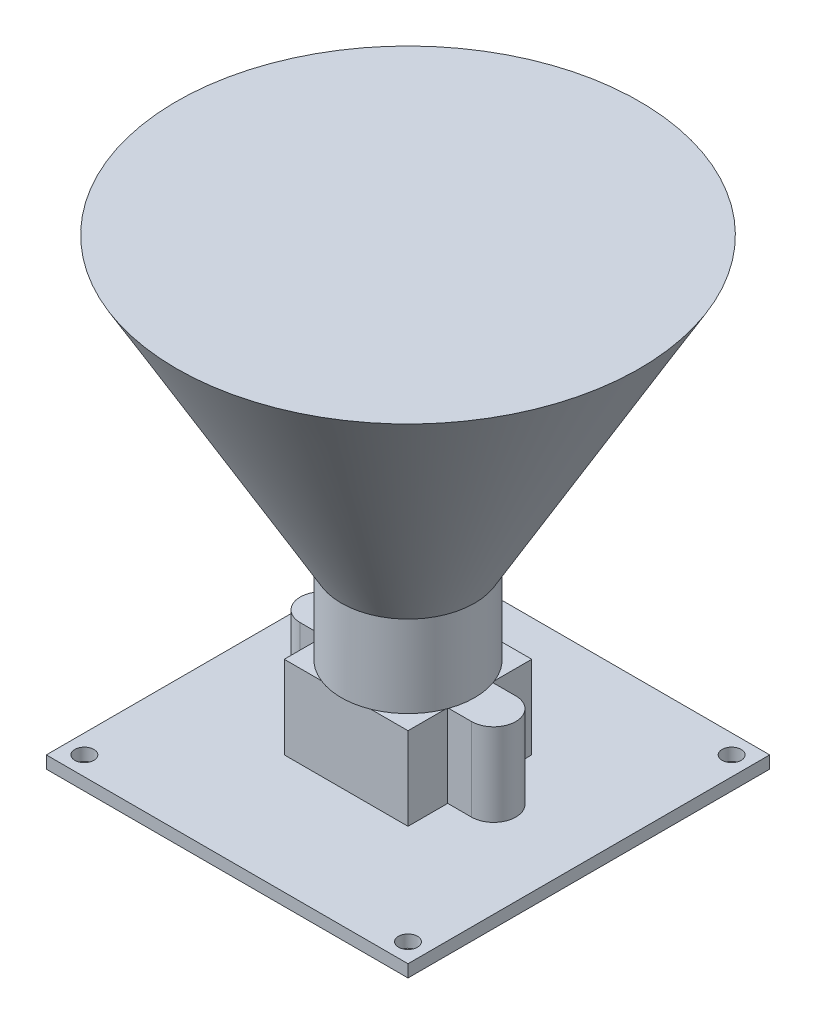
ISO-10303-21;
HEADER;
FILE_DESCRIPTION(('STEP AP214'),'2;1');
FILE_NAME('part.step','',(''),(''),'','','');
FILE_SCHEMA(('AUTOMOTIVE_DESIGN { 1 0 10303 214 1 1 1 1 }'));
ENDSEC;
DATA;
#1=APPLICATION_CONTEXT('core data for automotive mechanical design processes');
#2=APPLICATION_PROTOCOL_DEFINITION('international standard','automotive_design',2000,#1);
#3=PRODUCT_CONTEXT('',#1,'mechanical');
#4=PRODUCT('Part','Part','',(#3));
#5=PRODUCT_RELATED_PRODUCT_CATEGORY('part','',(#4));
#6=PRODUCT_DEFINITION_FORMATION('','',#4);
#7=PRODUCT_DEFINITION_CONTEXT('part definition',#1,'design');
#8=PRODUCT_DEFINITION('design','',#6,#7);
#9=PRODUCT_DEFINITION_SHAPE('','',#8);
#10=(LENGTH_UNIT() NAMED_UNIT(*) SI_UNIT(.MILLI.,.METRE.));
#11=(NAMED_UNIT(*) PLANE_ANGLE_UNIT() SI_UNIT($,.RADIAN.));
#12=(NAMED_UNIT(*) SI_UNIT($,.STERADIAN.) SOLID_ANGLE_UNIT());
#13=UNCERTAINTY_MEASURE_WITH_UNIT(LENGTH_MEASURE(1.E-05),#10,'distance_accuracy_value','');
#14=(GEOMETRIC_REPRESENTATION_CONTEXT(3) GLOBAL_UNCERTAINTY_ASSIGNED_CONTEXT((#13)) GLOBAL_UNIT_ASSIGNED_CONTEXT((#10,
#11,#12)) REPRESENTATION_CONTEXT('',''));
#15=CARTESIAN_POINT('',(0.,0.,0.));
#16=DIRECTION('',(0.,0.,1.));
#17=DIRECTION('',(1.,0.,0.));
#18=AXIS2_PLACEMENT_3D('',#15,#16,#17);
#19=CARTESIAN_POINT('',(-4.38653846154582,10.,5.00576923076922));
#20=DIRECTION('',(0.,1.,0.));
#21=DIRECTION('',(0.,0.,1.));
#22=AXIS2_PLACEMENT_3D('',#19,#20,#21);
#23=PLANE('',#22);
#24=CARTESIAN_POINT('',(4.61346153845418,10.,5.00576923076922));
#25=DIRECTION('',(0.,1.,0.));
#26=DIRECTION('',(0.,0.,1.));
#27=AXIS2_PLACEMENT_3D('',#24,#25,#26);
#28=CIRCLE('',#27,7.);
#29=CARTESIAN_POINT('',(7.2115377498075,10.,11.5057692307692));
#30=VERTEX_POINT('',#29);
#31=CARTESIAN_POINT('',(11.1134615384542,10.,7.60384544212254));
#32=VERTEX_POINT('',#31);
#33=EDGE_CURVE('E215',#30,#32,#28,.T.);
#34=ORIENTED_EDGE('',*,*,#33,.F.);
#35=DIRECTION('',(1.,0.,0.));
#36=VECTOR('',#35,1.);
#37=CARTESIAN_POINT('',(-1.88653846154582,10.,11.5057692307692));
#38=LINE('',#37,#36);
#39=CARTESIAN_POINT('',(11.1134615384542,10.,11.5057692307692));
#40=VERTEX_POINT('',#39);
#41=EDGE_CURVE('E201',#30,#40,#38,.T.);
#42=ORIENTED_EDGE('',*,*,#41,.T.);
#43=DIRECTION('',(0.,0.,-1.));
#44=VECTOR('',#43,1.);
#45=CARTESIAN_POINT('',(11.1134615384542,10.,11.5057692307692));
#46=LINE('',#45,#44);
#47=EDGE_CURVE('E267',#40,#32,#46,.T.);
#48=ORIENTED_EDGE('',*,*,#47,.T.);
#49=EDGE_LOOP('',(#34,#42,#48));
#50=FACE_BOUND('',#49,.T.);
#51=ADVANCED_FACE('F38',(#50),#23,.T.);
#52=CARTESIAN_POINT('',(11.2150175404706,10.,7.3337422444104));
#53=VERTEX_POINT('',#52);
#54=CARTESIAN_POINT('',(11.2150175404706,10.,2.67779621712804));
#55=VERTEX_POINT('',#54);
#56=EDGE_CURVE('E11',#53,#55,#28,.T.);
#57=ORIENTED_EDGE('',*,*,#56,.F.);
#58=DIRECTION('',(1.,0.,0.));
#59=VECTOR('',#58,1.);
#60=CARTESIAN_POINT('',(11.1134615384542,10.,7.3337422444104));
#61=LINE('',#60,#59);
#62=CARTESIAN_POINT('',(13.6134615384542,10.,7.33374224441039));
#63=VERTEX_POINT('',#62);
#64=EDGE_CURVE('E270',#53,#63,#61,.T.);
#65=ORIENTED_EDGE('',*,*,#64,.T.);
#66=CARTESIAN_POINT('',(13.6134615384542,10.,5.00576923076922));
#67=DIRECTION('',(0.,1.,0.));
#68=DIRECTION('',(0.,0.,1.));
#69=AXIS2_PLACEMENT_3D('',#66,#67,#68);
#70=CIRCLE('',#69,2.32797301364118);
#71=CARTESIAN_POINT('',(13.6134615384542,10.,2.67779621712805));
#72=VERTEX_POINT('',#71);
#73=EDGE_CURVE('E274',#63,#72,#70,.T.);
#74=ORIENTED_EDGE('',*,*,#73,.T.);
#75=DIRECTION('',(-1.,0.,0.));
#76=VECTOR('',#75,1.);
#77=CARTESIAN_POINT('',(11.1134615384542,10.,2.67779621712804));
#78=LINE('',#77,#76);
#79=EDGE_CURVE('E276',#72,#55,#78,.T.);
#80=ORIENTED_EDGE('',*,*,#79,.T.);
#81=EDGE_LOOP('',(#57,#65,#74,#80));
#82=FACE_BOUND('',#81,.T.);
#83=ADVANCED_FACE('F414',(#82),#23,.T.);
#84=CARTESIAN_POINT('',(11.1134615384542,10.,2.4076930194159));
#85=VERTEX_POINT('',#84);
#86=CARTESIAN_POINT('',(7.21153774980749,10.,-1.49423076923078));
#87=VERTEX_POINT('',#86);
#88=EDGE_CURVE('E47',#85,#87,#28,.T.);
#89=ORIENTED_EDGE('',*,*,#88,.F.);
#90=DIRECTION('',(0.,0.,-1.));
#91=VECTOR('',#90,1.);
#92=CARTESIAN_POINT('',(11.1134615384542,10.,2.67779621712804));
#93=LINE('',#92,#91);
#94=CARTESIAN_POINT('',(11.1134615384542,10.,-1.49423076923078));
#95=VERTEX_POINT('',#94);
#96=EDGE_CURVE('E304',#85,#95,#93,.T.);
#97=ORIENTED_EDGE('',*,*,#96,.T.);
#98=DIRECTION('',(-1.,0.,0.));
#99=VECTOR('',#98,1.);
#100=CARTESIAN_POINT('',(-1.88653846154582,10.,-1.49423076923078));
#101=LINE('',#100,#99);
#102=EDGE_CURVE('E794',#95,#87,#101,.T.);
#103=ORIENTED_EDGE('',*,*,#102,.T.);
#104=EDGE_LOOP('',(#89,#97,#103));
#105=FACE_BOUND('',#104,.T.);
#106=ADVANCED_FACE('F420',(#105),#23,.T.);
#107=CARTESIAN_POINT('',(2.01538532710086,10.,-1.49423076923078));
#108=VERTEX_POINT('',#107);
#109=CARTESIAN_POINT('',(-1.88653846154582,10.,2.40769301941591));
#110=VERTEX_POINT('',#109);
#111=EDGE_CURVE('E221',#108,#110,#28,.T.);
#112=ORIENTED_EDGE('',*,*,#111,.F.);
#113=CARTESIAN_POINT('',(-1.88653846154582,10.,-1.49423076923078));
#114=VERTEX_POINT('',#113);
#115=EDGE_CURVE('E792',#108,#114,#101,.T.);
#116=ORIENTED_EDGE('',*,*,#115,.T.);
#117=DIRECTION('',(0.,0.,1.));
#118=VECTOR('',#117,1.);
#119=CARTESIAN_POINT('',(-1.88653846154582,10.,2.67779621712805));
#120=LINE('',#119,#118);
#121=EDGE_CURVE('E257',#114,#110,#120,.T.);
#122=ORIENTED_EDGE('',*,*,#121,.T.);
#123=EDGE_LOOP('',(#112,#116,#122));
#124=FACE_BOUND('',#123,.T.);
#125=ADVANCED_FACE('F436',(#124),#23,.T.);
#126=CARTESIAN_POINT('',(-1.9880944635622,10.,2.67779621712805));
#127=VERTEX_POINT('',#126);
#128=CARTESIAN_POINT('',(-1.9880944635622,10.,7.3337422444104));
#129=VERTEX_POINT('',#128);
#130=EDGE_CURVE('E220',#127,#129,#28,.T.);
#131=ORIENTED_EDGE('',*,*,#130,.F.);
#132=DIRECTION('',(-1.,0.,0.));
#133=VECTOR('',#132,1.);
#134=CARTESIAN_POINT('',(-4.38653846154582,10.,2.67779621712805));
#135=LINE('',#134,#133);
#136=CARTESIAN_POINT('',(-4.38653846154582,10.,2.67779621712805));
#137=VERTEX_POINT('',#136);
#138=EDGE_CURVE('E253',#127,#137,#135,.T.);
#139=ORIENTED_EDGE('',*,*,#138,.T.);
#140=CARTESIAN_POINT('',(-4.38653846154582,10.,5.00576923076922));
#141=DIRECTION('',(0.,1.,0.));
#142=DIRECTION('',(0.,0.,1.));
#143=AXIS2_PLACEMENT_3D('',#140,#141,#142);
#144=CIRCLE('',#143,2.32797301364118);
#145=CARTESIAN_POINT('',(-4.38653846154582,10.,7.3337422444104));
#146=VERTEX_POINT('',#145);
#147=EDGE_CURVE('E252',#137,#146,#144,.T.);
#148=ORIENTED_EDGE('',*,*,#147,.T.);
#149=DIRECTION('',(1.,0.,0.));
#150=VECTOR('',#149,1.);
#151=CARTESIAN_POINT('',(-4.38653846154582,10.,7.3337422444104));
#152=LINE('',#151,#150);
#153=EDGE_CURVE('E261',#146,#129,#152,.T.);
#154=ORIENTED_EDGE('',*,*,#153,.T.);
#155=EDGE_LOOP('',(#131,#139,#148,#154));
#156=FACE_BOUND('',#155,.T.);
#157=ADVANCED_FACE('F426',(#156),#23,.T.);
#158=CARTESIAN_POINT('',(0.,1.3,0.));
#159=DIRECTION('',(0.,1.,0.));
#160=DIRECTION('',(0.,0.,1.));
#161=AXIS2_PLACEMENT_3D('',#158,#159,#160);
#162=PLANE('',#161);
#163=CARTESIAN_POINT('',(21.6134615384542,1.3,22.0057692307662));
#164=DIRECTION('',(0.,1.,0.));
#165=DIRECTION('',(0.,0.,1.));
#166=AXIS2_PLACEMENT_3D('',#163,#164,#165);
#167=CIRCLE('',#166,1.);
#168=CARTESIAN_POINT('',(21.6134615384542,1.3,23.0057692307662));
#169=VERTEX_POINT('',#168);
#170=EDGE_CURVE('E343',#169,#169,#167,.T.);
#171=ORIENTED_EDGE('',*,*,#170,.F.);
#172=EDGE_LOOP('',(#171));
#173=FACE_BOUND('',#172,.T.);
#174=CARTESIAN_POINT('',(-12.3865384615458,1.3,-11.9942307692338));
#175=DIRECTION('',(0.,1.,0.));
#176=DIRECTION('',(0.,0.,1.));
#177=AXIS2_PLACEMENT_3D('',#174,#175,#176);
#178=CIRCLE('',#177,1.);
#179=CARTESIAN_POINT('',(-12.3865384615458,1.3,-10.9942307692338));
#180=VERTEX_POINT('',#179);
#181=EDGE_CURVE('E355',#180,#180,#178,.T.);
#182=ORIENTED_EDGE('',*,*,#181,.F.);
#183=EDGE_LOOP('',(#182));
#184=FACE_BOUND('',#183,.T.);
#185=DIRECTION('',(0.,0.,1.));
#186=VECTOR('',#185,1.);
#187=CARTESIAN_POINT('',(-14.3865384615458,1.3,-13.9942307692308));
#188=LINE('',#187,#186);
#189=CARTESIAN_POINT('',(-14.3865384615458,1.3,-13.9942307692308));
#190=VERTEX_POINT('',#189);
#191=CARTESIAN_POINT('',(-14.3865384615458,1.3,24.0057692307692));
#192=VERTEX_POINT('',#191);
#193=EDGE_CURVE('E361',#190,#192,#188,.T.);
#194=ORIENTED_EDGE('',*,*,#193,.T.);
#195=DIRECTION('',(1.,0.,0.));
#196=VECTOR('',#195,1.);
#197=CARTESIAN_POINT('',(-14.3865384615458,1.3,24.0057692307692));
#198=LINE('',#197,#196);
#199=CARTESIAN_POINT('',(23.6134615384542,1.3,24.0057692307692));
#200=VERTEX_POINT('',#199);
#201=EDGE_CURVE('E364',#192,#200,#198,.T.);
#202=ORIENTED_EDGE('',*,*,#201,.T.);
#203=DIRECTION('',(0.,0.,-1.));
#204=VECTOR('',#203,1.);
#205=CARTESIAN_POINT('',(23.6134615384542,1.3,-13.9942307692308));
#206=LINE('',#205,#204);
#207=CARTESIAN_POINT('',(23.6134615384542,1.3,-13.9942307692308));
#208=VERTEX_POINT('',#207);
#209=EDGE_CURVE('E367',#200,#208,#206,.T.);
#210=ORIENTED_EDGE('',*,*,#209,.T.);
#211=DIRECTION('',(-1.,0.,0.));
#212=VECTOR('',#211,1.);
#213=CARTESIAN_POINT('',(-14.3865384615458,1.3,-13.9942307692308));
#214=LINE('',#213,#212);
#215=EDGE_CURVE('E369',#208,#190,#214,.T.);
#216=ORIENTED_EDGE('',*,*,#215,.T.);
#217=EDGE_LOOP('',(#194,#202,#210,#216));
#218=FACE_BOUND('',#217,.T.);
#219=CARTESIAN_POINT('',(21.6134615384542,1.3,-11.9942307692338));
#220=DIRECTION('',(0.,1.,0.));
#221=DIRECTION('',(0.,0.,1.));
#222=AXIS2_PLACEMENT_3D('',#219,#220,#221);
#223=CIRCLE('',#222,1.);
#224=CARTESIAN_POINT('',(21.6134615384542,1.3,-10.9942307692338));
#225=VERTEX_POINT('',#224);
#226=EDGE_CURVE('E349',#225,#225,#223,.T.);
#227=ORIENTED_EDGE('',*,*,#226,.F.);
#228=EDGE_LOOP('',(#227));
#229=FACE_BOUND('',#228,.T.);
#230=CARTESIAN_POINT('',(-12.3865384615458,1.3,22.0057692307662));
#231=DIRECTION('',(0.,1.,0.));
#232=DIRECTION('',(0.,0.,1.));
#233=AXIS2_PLACEMENT_3D('',#230,#231,#232);
#234=CIRCLE('',#233,1.);
#235=CARTESIAN_POINT('',(-12.3865384615458,1.3,23.0057692307662));
#236=VERTEX_POINT('',#235);
#237=EDGE_CURVE('E337',#236,#236,#234,.T.);
#238=ORIENTED_EDGE('',*,*,#237,.F.);
#239=EDGE_LOOP('',(#238));
#240=FACE_BOUND('',#239,.T.);
#241=DIRECTION('',(-1.,0.,0.));
#242=VECTOR('',#241,1.);
#243=CARTESIAN_POINT('',(-1.88653846154582,1.3,-1.49423076923078));
#244=LINE('',#243,#242);
#245=CARTESIAN_POINT('',(11.1134615384542,1.3,-1.49423076923078));
#246=VERTEX_POINT('',#245);
#247=CARTESIAN_POINT('',(-1.88653846154582,1.3,-1.49423076923078));
#248=VERTEX_POINT('',#247);
#249=EDGE_CURVE('E281',#246,#248,#244,.T.);
#250=ORIENTED_EDGE('',*,*,#249,.F.);
#251=DIRECTION('',(0.,0.,-1.));
#252=VECTOR('',#251,1.);
#253=CARTESIAN_POINT('',(11.1134615384542,1.3,2.67779621712804));
#254=LINE('',#253,#252);
#255=CARTESIAN_POINT('',(11.1134615384542,1.3,2.67779621712804));
#256=VERTEX_POINT('',#255);
#257=EDGE_CURVE('E229',#256,#246,#254,.T.);
#258=ORIENTED_EDGE('',*,*,#257,.F.);
#259=DIRECTION('',(-1.,0.,0.));
#260=VECTOR('',#259,1.);
#261=CARTESIAN_POINT('',(11.1134615384542,1.3,2.67779621712804));
#262=LINE('',#261,#260);
#263=CARTESIAN_POINT('',(13.6134615384542,1.3,2.67779621712804));
#264=VERTEX_POINT('',#263);
#265=EDGE_CURVE('E302',#264,#256,#262,.T.);
#266=ORIENTED_EDGE('',*,*,#265,.F.);
#267=CARTESIAN_POINT('',(13.6134615384542,1.3,5.00576923076922));
#268=DIRECTION('',(0.,1.,0.));
#269=DIRECTION('',(0.,0.,1.));
#270=AXIS2_PLACEMENT_3D('',#267,#268,#269);
#271=CIRCLE('',#270,2.32797301364118);
#272=CARTESIAN_POINT('',(13.6134615384542,1.3,7.33374224441039));
#273=VERTEX_POINT('',#272);
#274=EDGE_CURVE('E299',#273,#264,#271,.T.);
#275=ORIENTED_EDGE('',*,*,#274,.F.);
#276=DIRECTION('',(1.,0.,0.));
#277=VECTOR('',#276,1.);
#278=CARTESIAN_POINT('',(11.1134615384542,1.3,7.3337422444104));
#279=LINE('',#278,#277);
#280=CARTESIAN_POINT('',(11.1134615384542,1.3,7.3337422444104));
#281=VERTEX_POINT('',#280);
#282=EDGE_CURVE('E297',#281,#273,#279,.T.);
#283=ORIENTED_EDGE('',*,*,#282,.F.);
#284=DIRECTION('',(0.,0.,-1.));
#285=VECTOR('',#284,1.);
#286=CARTESIAN_POINT('',(11.1134615384542,1.3,11.5057692307692));
#287=LINE('',#286,#285);
#288=CARTESIAN_POINT('',(11.1134615384542,1.3,11.5057692307692));
#289=VERTEX_POINT('',#288);
#290=EDGE_CURVE('E295',#289,#281,#287,.T.);
#291=ORIENTED_EDGE('',*,*,#290,.F.);
#292=DIRECTION('',(1.,0.,0.));
#293=VECTOR('',#292,1.);
#294=CARTESIAN_POINT('',(-1.88653846154582,1.3,11.5057692307692));
#295=LINE('',#294,#293);
#296=CARTESIAN_POINT('',(-1.88653846154582,1.3,11.5057692307692));
#297=VERTEX_POINT('',#296);
#298=EDGE_CURVE('E293',#297,#289,#295,.T.);
#299=ORIENTED_EDGE('',*,*,#298,.F.);
#300=DIRECTION('',(0.,0.,1.));
#301=VECTOR('',#300,1.);
#302=CARTESIAN_POINT('',(-1.88653846154582,1.3,11.5057692307692));
#303=LINE('',#302,#301);
#304=CARTESIAN_POINT('',(-1.88653846154582,1.3,7.3337422444104));
#305=VERTEX_POINT('',#304);
#306=EDGE_CURVE('E291',#305,#297,#303,.T.);
#307=ORIENTED_EDGE('',*,*,#306,.F.);
#308=DIRECTION('',(1.,0.,0.));
#309=VECTOR('',#308,1.);
#310=CARTESIAN_POINT('',(-4.38653846154582,1.3,7.3337422444104));
#311=LINE('',#310,#309);
#312=CARTESIAN_POINT('',(-4.38653846154582,1.3,7.3337422444104));
#313=VERTEX_POINT('',#312);
#314=EDGE_CURVE('E289',#313,#305,#311,.T.);
#315=ORIENTED_EDGE('',*,*,#314,.F.);
#316=CARTESIAN_POINT('',(-4.38653846154582,1.3,5.00576923076922));
#317=DIRECTION('',(0.,1.,0.));
#318=DIRECTION('',(0.,0.,1.));
#319=AXIS2_PLACEMENT_3D('',#316,#317,#318);
#320=CIRCLE('',#319,2.32797301364118);
#321=CARTESIAN_POINT('',(-4.38653846154582,1.3,2.67779621712805));
#322=VERTEX_POINT('',#321);
#323=EDGE_CURVE('E287',#322,#313,#320,.T.);
#324=ORIENTED_EDGE('',*,*,#323,.F.);
#325=DIRECTION('',(-1.,0.,0.));
#326=VECTOR('',#325,1.);
#327=CARTESIAN_POINT('',(-4.38653846154582,1.3,2.67779621712805));
#328=LINE('',#327,#326);
#329=CARTESIAN_POINT('',(-1.88653846154582,1.3,2.67779621712805));
#330=VERTEX_POINT('',#329);
#331=EDGE_CURVE('E285',#330,#322,#328,.T.);
#332=ORIENTED_EDGE('',*,*,#331,.F.);
#333=DIRECTION('',(0.,0.,1.));
#334=VECTOR('',#333,1.);
#335=CARTESIAN_POINT('',(-1.88653846154582,1.3,2.67779621712805));
#336=LINE('',#335,#334);
#337=EDGE_CURVE('E283',#248,#330,#336,.T.);
#338=ORIENTED_EDGE('',*,*,#337,.F.);
#339=EDGE_LOOP('',(#250,#258,#266,#275,#283,#291,#299,#307,#315,#324,#332,#338));
#340=FACE_BOUND('',#339,.T.);
#341=ADVANCED_FACE('F404',(#173,#184,#218,#229,#240,#340),#162,.T.);
#342=CARTESIAN_POINT('',(0.,0.,0.));
#343=DIRECTION('',(0.,1.,0.));
#344=DIRECTION('',(0.,0.,1.));
#345=AXIS2_PLACEMENT_3D('',#342,#343,#344);
#346=PLANE('',#345);
#347=DIRECTION('',(0.,0.,1.));
#348=VECTOR('',#347,1.);
#349=CARTESIAN_POINT('',(-14.3865384615458,0.,-13.9942307692308));
#350=LINE('',#349,#348);
#351=CARTESIAN_POINT('',(-14.3865384615458,0.,-13.9942307692308));
#352=VERTEX_POINT('',#351);
#353=CARTESIAN_POINT('',(-14.3865384615458,0.,24.0057692307692));
#354=VERTEX_POINT('',#353);
#355=EDGE_CURVE('E358',#352,#354,#350,.T.);
#356=ORIENTED_EDGE('',*,*,#355,.F.);
#357=DIRECTION('',(-1.,0.,0.));
#358=VECTOR('',#357,1.);
#359=CARTESIAN_POINT('',(-14.3865384615458,0.,-13.9942307692308));
#360=LINE('',#359,#358);
#361=CARTESIAN_POINT('',(23.6134615384542,0.,-13.9942307692308));
#362=VERTEX_POINT('',#361);
#363=EDGE_CURVE('E365',#362,#352,#360,.T.);
#364=ORIENTED_EDGE('',*,*,#363,.F.);
#365=DIRECTION('',(0.,0.,-1.));
#366=VECTOR('',#365,1.);
#367=CARTESIAN_POINT('',(23.6134615384542,0.,-13.9942307692308));
#368=LINE('',#367,#366);
#369=CARTESIAN_POINT('',(23.6134615384542,0.,24.0057692307692));
#370=VERTEX_POINT('',#369);
#371=EDGE_CURVE('E376',#370,#362,#368,.T.);
#372=ORIENTED_EDGE('',*,*,#371,.F.);
#373=DIRECTION('',(1.,0.,0.));
#374=VECTOR('',#373,1.);
#375=CARTESIAN_POINT('',(-14.3865384615458,0.,24.0057692307692));
#376=LINE('',#375,#374);
#377=EDGE_CURVE('E374',#354,#370,#376,.T.);
#378=ORIENTED_EDGE('',*,*,#377,.F.);
#379=EDGE_LOOP('',(#356,#364,#372,#378));
#380=FACE_BOUND('',#379,.T.);
#381=CARTESIAN_POINT('',(-12.3865384615458,0.,-11.9942307692338));
#382=DIRECTION('',(0.,1.,0.));
#383=DIRECTION('',(0.,0.,1.));
#384=AXIS2_PLACEMENT_3D('',#381,#382,#383);
#385=CIRCLE('',#384,1.);
#386=CARTESIAN_POINT('',(-12.3865384615458,0.,-10.9942307692338));
#387=VERTEX_POINT('',#386);
#388=EDGE_CURVE('E352',#387,#387,#385,.T.);
#389=ORIENTED_EDGE('',*,*,#388,.T.);
#390=EDGE_LOOP('',(#389));
#391=FACE_BOUND('',#390,.T.);
#392=CARTESIAN_POINT('',(21.6134615384542,0.,-11.9942307692338));
#393=DIRECTION('',(0.,1.,0.));
#394=DIRECTION('',(0.,0.,1.));
#395=AXIS2_PLACEMENT_3D('',#392,#393,#394);
#396=CIRCLE('',#395,1.);
#397=CARTESIAN_POINT('',(21.6134615384542,0.,-10.9942307692338));
#398=VERTEX_POINT('',#397);
#399=EDGE_CURVE('E346',#398,#398,#396,.T.);
#400=ORIENTED_EDGE('',*,*,#399,.T.);
#401=EDGE_LOOP('',(#400));
#402=FACE_BOUND('',#401,.T.);
#403=CARTESIAN_POINT('',(21.6134615384542,0.,22.0057692307662));
#404=DIRECTION('',(0.,1.,0.));
#405=DIRECTION('',(0.,0.,1.));
#406=AXIS2_PLACEMENT_3D('',#403,#404,#405);
#407=CIRCLE('',#406,1.);
#408=CARTESIAN_POINT('',(21.6134615384542,0.,23.0057692307662));
#409=VERTEX_POINT('',#408);
#410=EDGE_CURVE('E340',#409,#409,#407,.T.);
#411=ORIENTED_EDGE('',*,*,#410,.T.);
#412=EDGE_LOOP('',(#411));
#413=FACE_BOUND('',#412,.T.);
#414=CARTESIAN_POINT('',(-12.3865384615458,0.,22.0057692307662));
#415=DIRECTION('',(0.,1.,0.));
#416=DIRECTION('',(0.,0.,1.));
#417=AXIS2_PLACEMENT_3D('',#414,#415,#416);
#418=CIRCLE('',#417,1.);
#419=CARTESIAN_POINT('',(-12.3865384615458,0.,23.0057692307662));
#420=VERTEX_POINT('',#419);
#421=EDGE_CURVE('E336',#420,#420,#418,.T.);
#422=ORIENTED_EDGE('',*,*,#421,.T.);
#423=EDGE_LOOP('',(#422));
#424=FACE_BOUND('',#423,.T.);
#425=ADVANCED_FACE('F394',(#380,#391,#402,#413,#424),#346,.F.);
#426=CARTESIAN_POINT('',(-14.3865384615458,1.3,-13.9942307692308));
#427=DIRECTION('',(1.,0.,0.));
#428=DIRECTION('',(0.,0.,-1.));
#429=AXIS2_PLACEMENT_3D('',#426,#427,#428);
#430=PLANE('',#429);
#431=ORIENTED_EDGE('',*,*,#355,.T.);
#432=DIRECTION('',(0.,-1.,0.));
#433=VECTOR('',#432,1.);
#434=CARTESIAN_POINT('',(-14.3865384615458,1.3,24.0057692307692));
#435=LINE('',#434,#433);
#436=EDGE_CURVE('E42',#192,#354,#435,.T.);
#437=ORIENTED_EDGE('',*,*,#436,.F.);
#438=ORIENTED_EDGE('',*,*,#193,.F.);
#439=DIRECTION('',(0.,-1.,0.));
#440=VECTOR('',#439,1.);
#441=CARTESIAN_POINT('',(-14.3865384615458,1.3,-13.9942307692308));
#442=LINE('',#441,#440);
#443=EDGE_CURVE('E371',#190,#352,#442,.T.);
#444=ORIENTED_EDGE('',*,*,#443,.T.);
#445=EDGE_LOOP('',(#431,#437,#438,#444));
#446=FACE_BOUND('',#445,.T.);
#447=ADVANCED_FACE('F40',(#446),#430,.F.);
#448=CARTESIAN_POINT('',(-14.3865384615458,1.3,24.0057692307692));
#449=DIRECTION('',(0.,0.,-1.));
#450=DIRECTION('',(-1.,0.,0.));
#451=AXIS2_PLACEMENT_3D('',#448,#449,#450);
#452=PLANE('',#451);
#453=ORIENTED_EDGE('',*,*,#377,.T.);
#454=DIRECTION('',(0.,-1.,0.));
#455=VECTOR('',#454,1.);
#456=CARTESIAN_POINT('',(23.6134615384542,1.3,24.0057692307692));
#457=LINE('',#456,#455);
#458=EDGE_CURVE('E223',#200,#370,#457,.T.);
#459=ORIENTED_EDGE('',*,*,#458,.F.);
#460=ORIENTED_EDGE('',*,*,#201,.F.);
#461=ORIENTED_EDGE('',*,*,#436,.T.);
#462=EDGE_LOOP('',(#453,#459,#460,#461));
#463=FACE_BOUND('',#462,.T.);
#464=ADVANCED_FACE('F406',(#463),#452,.F.);
#465=CARTESIAN_POINT('',(23.6134615384542,1.3,-13.9942307692308));
#466=DIRECTION('',(-1.,0.,0.));
#467=DIRECTION('',(0.,0.,1.));
#468=AXIS2_PLACEMENT_3D('',#465,#466,#467);
#469=PLANE('',#468);
#470=ORIENTED_EDGE('',*,*,#371,.T.);
#471=DIRECTION('',(0.,-1.,0.));
#472=VECTOR('',#471,1.);
#473=CARTESIAN_POINT('',(23.6134615384542,1.3,-13.9942307692308));
#474=LINE('',#473,#472);
#475=EDGE_CURVE('E381',#208,#362,#474,.T.);
#476=ORIENTED_EDGE('',*,*,#475,.F.);
#477=ORIENTED_EDGE('',*,*,#209,.F.);
#478=ORIENTED_EDGE('',*,*,#458,.T.);
#479=EDGE_LOOP('',(#470,#476,#477,#478));
#480=FACE_BOUND('',#479,.T.);
#481=ADVANCED_FACE('F388',(#480),#469,.F.);
#482=CARTESIAN_POINT('',(-14.3865384615458,1.3,-13.9942307692308));
#483=DIRECTION('',(0.,0.,1.));
#484=DIRECTION('',(1.,0.,0.));
#485=AXIS2_PLACEMENT_3D('',#482,#483,#484);
#486=PLANE('',#485);
#487=ORIENTED_EDGE('',*,*,#363,.T.);
#488=ORIENTED_EDGE('',*,*,#443,.F.);
#489=ORIENTED_EDGE('',*,*,#215,.F.);
#490=ORIENTED_EDGE('',*,*,#475,.T.);
#491=EDGE_LOOP('',(#487,#488,#489,#490));
#492=FACE_BOUND('',#491,.T.);
#493=ADVANCED_FACE('F398',(#492),#486,.F.);
#494=CARTESIAN_POINT('',(-12.3865384615458,1.3,-11.9942307692338));
#495=DIRECTION('',(0.,-1.,0.));
#496=DIRECTION('',(0.,0.,-1.));
#497=AXIS2_PLACEMENT_3D('',#494,#495,#496);
#498=CYLINDRICAL_SURFACE('',#497,1.);
#499=ORIENTED_EDGE('',*,*,#181,.T.);
#500=EDGE_LOOP('',(#499));
#501=FACE_BOUND('',#500,.T.);
#502=ORIENTED_EDGE('',*,*,#388,.F.);
#503=EDGE_LOOP('',(#502));
#504=FACE_BOUND('',#503,.T.);
#505=ADVANCED_FACE('F721',(#501,#504),#498,.F.);
#506=CARTESIAN_POINT('',(21.6134615384542,1.3,-11.9942307692338));
#507=DIRECTION('',(0.,-1.,0.));
#508=DIRECTION('',(0.,0.,-1.));
#509=AXIS2_PLACEMENT_3D('',#506,#507,#508);
#510=CYLINDRICAL_SURFACE('',#509,1.);
#511=ORIENTED_EDGE('',*,*,#226,.T.);
#512=EDGE_LOOP('',(#511));
#513=FACE_BOUND('',#512,.T.);
#514=ORIENTED_EDGE('',*,*,#399,.F.);
#515=EDGE_LOOP('',(#514));
#516=FACE_BOUND('',#515,.T.);
#517=ADVANCED_FACE('F711',(#513,#516),#510,.F.);
#518=CARTESIAN_POINT('',(21.6134615384542,1.3,22.0057692307662));
#519=DIRECTION('',(0.,-1.,0.));
#520=DIRECTION('',(0.,0.,-1.));
#521=AXIS2_PLACEMENT_3D('',#518,#519,#520);
#522=CYLINDRICAL_SURFACE('',#521,1.);
#523=ORIENTED_EDGE('',*,*,#170,.T.);
#524=EDGE_LOOP('',(#523));
#525=FACE_BOUND('',#524,.T.);
#526=ORIENTED_EDGE('',*,*,#410,.F.);
#527=EDGE_LOOP('',(#526));
#528=FACE_BOUND('',#527,.T.);
#529=ADVANCED_FACE('F701',(#525,#528),#522,.F.);
#530=CARTESIAN_POINT('',(-12.3865384615458,1.3,22.0057692307662));
#531=DIRECTION('',(0.,-1.,0.));
#532=DIRECTION('',(0.,0.,-1.));
#533=AXIS2_PLACEMENT_3D('',#530,#531,#532);
#534=CYLINDRICAL_SURFACE('',#533,1.);
#535=ORIENTED_EDGE('',*,*,#237,.T.);
#536=EDGE_LOOP('',(#535));
#537=FACE_BOUND('',#536,.T.);
#538=ORIENTED_EDGE('',*,*,#421,.F.);
#539=EDGE_LOOP('',(#538));
#540=FACE_BOUND('',#539,.T.);
#541=ADVANCED_FACE('F644',(#537,#540),#534,.F.);
#542=CARTESIAN_POINT('',(11.1134615384542,10.,2.67779621712804));
#543=DIRECTION('',(-1.,0.,0.));
#544=DIRECTION('',(0.,0.,1.));
#545=AXIS2_PLACEMENT_3D('',#542,#543,#544);
#546=PLANE('',#545);
#547=ORIENTED_EDGE('',*,*,#257,.T.);
#548=DIRECTION('',(0.,-1.,0.));
#549=VECTOR('',#548,1.);
#550=CARTESIAN_POINT('',(11.1134615384542,10.,-1.49423076923078));
#551=LINE('',#550,#549);
#552=EDGE_CURVE('E334',#95,#246,#551,.T.);
#553=ORIENTED_EDGE('',*,*,#552,.F.);
#554=ORIENTED_EDGE('',*,*,#96,.F.);
#555=CARTESIAN_POINT('',(11.1134615384542,10.,2.67779621712804));
#556=VERTEX_POINT('',#555);
#557=EDGE_CURVE('E791',#556,#85,#93,.T.);
#558=ORIENTED_EDGE('',*,*,#557,.F.);
#559=DIRECTION('',(0.,-1.,0.));
#560=VECTOR('',#559,1.);
#561=CARTESIAN_POINT('',(11.1134615384542,10.,2.67779621712804));
#562=LINE('',#561,#560);
#563=EDGE_CURVE('E278',#556,#256,#562,.T.);
#564=ORIENTED_EDGE('',*,*,#563,.T.);
#565=EDGE_LOOP('',(#547,#553,#554,#558,#564));
#566=FACE_BOUND('',#565,.T.);
#567=ADVANCED_FACE('F635',(#566),#546,.F.);
#568=CARTESIAN_POINT('',(-1.88653846154582,10.,-1.49423076923078));
#569=DIRECTION('',(0.,0.,1.));
#570=DIRECTION('',(1.,0.,0.));
#571=AXIS2_PLACEMENT_3D('',#568,#569,#570);
#572=PLANE('',#571);
#573=ORIENTED_EDGE('',*,*,#249,.T.);
#574=DIRECTION('',(0.,-1.,0.));
#575=VECTOR('',#574,1.);
#576=CARTESIAN_POINT('',(-1.88653846154582,10.,-1.49423076923078));
#577=LINE('',#576,#575);
#578=EDGE_CURVE('E331',#114,#248,#577,.T.);
#579=ORIENTED_EDGE('',*,*,#578,.F.);
#580=ORIENTED_EDGE('',*,*,#115,.F.);
#581=EDGE_CURVE('E793',#87,#108,#101,.T.);
#582=ORIENTED_EDGE('',*,*,#581,.F.);
#583=ORIENTED_EDGE('',*,*,#102,.F.);
#584=ORIENTED_EDGE('',*,*,#552,.T.);
#585=EDGE_LOOP('',(#573,#579,#580,#582,#583,#584));
#586=FACE_BOUND('',#585,.T.);
#587=ADVANCED_FACE('F625',(#586),#572,.F.);
#588=CARTESIAN_POINT('',(-1.88653846154582,10.,2.67779621712805));
#589=DIRECTION('',(1.,0.,0.));
#590=DIRECTION('',(0.,0.,-1.));
#591=AXIS2_PLACEMENT_3D('',#588,#589,#590);
#592=PLANE('',#591);
#593=ORIENTED_EDGE('',*,*,#337,.T.);
#594=DIRECTION('',(0.,-1.,0.));
#595=VECTOR('',#594,1.);
#596=CARTESIAN_POINT('',(-1.88653846154582,10.,2.67779621712805));
#597=LINE('',#596,#595);
#598=CARTESIAN_POINT('',(-1.88653846154582,10.,2.67779621712805));
#599=VERTEX_POINT('',#598);
#600=EDGE_CURVE('E329',#599,#330,#597,.T.);
#601=ORIENTED_EDGE('',*,*,#600,.F.);
#602=EDGE_CURVE('E246',#110,#599,#120,.T.);
#603=ORIENTED_EDGE('',*,*,#602,.F.);
#604=ORIENTED_EDGE('',*,*,#121,.F.);
#605=ORIENTED_EDGE('',*,*,#578,.T.);
#606=EDGE_LOOP('',(#593,#601,#603,#604,#605));
#607=FACE_BOUND('',#606,.T.);
#608=ADVANCED_FACE('F616',(#607),#592,.F.);
#609=CARTESIAN_POINT('',(-4.38653846154582,10.,2.67779621712805));
#610=DIRECTION('',(0.,0.,1.));
#611=DIRECTION('',(1.,0.,0.));
#612=AXIS2_PLACEMENT_3D('',#609,#610,#611);
#613=PLANE('',#612);
#614=ORIENTED_EDGE('',*,*,#331,.T.);
#615=DIRECTION('',(0.,-1.,0.));
#616=VECTOR('',#615,1.);
#617=CARTESIAN_POINT('',(-4.38653846154582,10.,2.67779621712805));
#618=LINE('',#617,#616);
#619=EDGE_CURVE('E326',#137,#322,#618,.T.);
#620=ORIENTED_EDGE('',*,*,#619,.F.);
#621=ORIENTED_EDGE('',*,*,#138,.F.);
#622=EDGE_CURVE('E248',#599,#127,#135,.T.);
#623=ORIENTED_EDGE('',*,*,#622,.F.);
#624=ORIENTED_EDGE('',*,*,#600,.T.);
#625=EDGE_LOOP('',(#614,#620,#621,#623,#624));
#626=FACE_BOUND('',#625,.T.);
#627=ADVANCED_FACE('F447',(#626),#613,.F.);
#628=CARTESIAN_POINT('',(-4.38653846154582,10.,5.00576923076922));
#629=DIRECTION('',(0.,-1.,0.));
#630=DIRECTION('',(0.,0.,-1.));
#631=AXIS2_PLACEMENT_3D('',#628,#629,#630);
#632=CYLINDRICAL_SURFACE('',#631,2.32797301364118);
#633=ORIENTED_EDGE('',*,*,#323,.T.);
#634=DIRECTION('',(0.,-1.,0.));
#635=VECTOR('',#634,1.);
#636=CARTESIAN_POINT('',(-4.38653846154582,10.,7.3337422444104));
#637=LINE('',#636,#635);
#638=EDGE_CURVE('E323',#146,#313,#637,.T.);
#639=ORIENTED_EDGE('',*,*,#638,.F.);
#640=ORIENTED_EDGE('',*,*,#147,.F.);
#641=ORIENTED_EDGE('',*,*,#619,.T.);
#642=EDGE_LOOP('',(#633,#639,#640,#641));
#643=FACE_BOUND('',#642,.T.);
#644=ADVANCED_FACE('F453',(#643),#632,.T.);
#645=CARTESIAN_POINT('',(-4.38653846154582,10.,7.3337422444104));
#646=DIRECTION('',(0.,0.,-1.));
#647=DIRECTION('',(-1.,0.,0.));
#648=AXIS2_PLACEMENT_3D('',#645,#646,#647);
#649=PLANE('',#648);
#650=ORIENTED_EDGE('',*,*,#314,.T.);
#651=DIRECTION('',(0.,-1.,0.));
#652=VECTOR('',#651,1.);
#653=CARTESIAN_POINT('',(-1.88653846154582,10.,7.3337422444104));
#654=LINE('',#653,#652);
#655=CARTESIAN_POINT('',(-1.88653846154582,10.,7.3337422444104));
#656=VERTEX_POINT('',#655);
#657=EDGE_CURVE('E320',#656,#305,#654,.T.);
#658=ORIENTED_EDGE('',*,*,#657,.F.);
#659=EDGE_CURVE('E255',#129,#656,#152,.T.);
#660=ORIENTED_EDGE('',*,*,#659,.F.);
#661=ORIENTED_EDGE('',*,*,#153,.F.);
#662=ORIENTED_EDGE('',*,*,#638,.T.);
#663=EDGE_LOOP('',(#650,#658,#660,#661,#662));
#664=FACE_BOUND('',#663,.T.);
#665=ADVANCED_FACE('F456',(#664),#649,.F.);
#666=CARTESIAN_POINT('',(-1.88653846154582,10.,11.5057692307692));
#667=DIRECTION('',(1.,0.,0.));
#668=DIRECTION('',(0.,0.,-1.));
#669=AXIS2_PLACEMENT_3D('',#666,#667,#668);
#670=PLANE('',#669);
#671=ORIENTED_EDGE('',*,*,#306,.T.);
#672=DIRECTION('',(0.,-1.,0.));
#673=VECTOR('',#672,1.);
#674=CARTESIAN_POINT('',(-1.88653846154582,10.,11.5057692307692));
#675=LINE('',#674,#673);
#676=CARTESIAN_POINT('',(-1.88653846154582,10.,11.5057692307692));
#677=VERTEX_POINT('',#676);
#678=EDGE_CURVE('E318',#677,#297,#675,.T.);
#679=ORIENTED_EDGE('',*,*,#678,.F.);
#680=DIRECTION('',(0.,0.,1.));
#681=VECTOR('',#680,1.);
#682=CARTESIAN_POINT('',(-1.88653846154582,10.,11.5057692307692));
#683=LINE('',#682,#681);
#684=CARTESIAN_POINT('',(-1.88653846154582,10.,7.60384544212254));
#685=VERTEX_POINT('',#684);
#686=EDGE_CURVE('E194',#685,#677,#683,.T.);
#687=ORIENTED_EDGE('',*,*,#686,.F.);
#688=EDGE_CURVE('E264',#656,#685,#683,.T.);
#689=ORIENTED_EDGE('',*,*,#688,.F.);
#690=ORIENTED_EDGE('',*,*,#657,.T.);
#691=EDGE_LOOP('',(#671,#679,#687,#689,#690));
#692=FACE_BOUND('',#691,.T.);
#693=ADVANCED_FACE('F462',(#692),#670,.F.);
#694=CARTESIAN_POINT('',(-1.88653846154582,10.,11.5057692307692));
#695=DIRECTION('',(0.,0.,-1.));
#696=DIRECTION('',(-1.,0.,0.));
#697=AXIS2_PLACEMENT_3D('',#694,#695,#696);
#698=PLANE('',#697);
#699=ORIENTED_EDGE('',*,*,#298,.T.);
#700=DIRECTION('',(0.,-1.,0.));
#701=VECTOR('',#700,1.);
#702=CARTESIAN_POINT('',(11.1134615384542,10.,11.5057692307692));
#703=LINE('',#702,#701);
#704=EDGE_CURVE('E315',#40,#289,#703,.T.);
#705=ORIENTED_EDGE('',*,*,#704,.F.);
#706=ORIENTED_EDGE('',*,*,#41,.F.);
#707=CARTESIAN_POINT('',(2.01538532710086,10.,11.5057692307692));
#708=VERTEX_POINT('',#707);
#709=EDGE_CURVE('E199',#708,#30,#38,.T.);
#710=ORIENTED_EDGE('',*,*,#709,.F.);
#711=EDGE_CURVE('E188',#677,#708,#38,.T.);
#712=ORIENTED_EDGE('',*,*,#711,.F.);
#713=ORIENTED_EDGE('',*,*,#678,.T.);
#714=EDGE_LOOP('',(#699,#705,#706,#710,#712,#713));
#715=FACE_BOUND('',#714,.T.);
#716=ADVANCED_FACE('F205',(#715),#698,.F.);
#717=CARTESIAN_POINT('',(11.1134615384542,10.,11.5057692307692));
#718=DIRECTION('',(-1.,0.,0.));
#719=DIRECTION('',(0.,0.,1.));
#720=AXIS2_PLACEMENT_3D('',#717,#718,#719);
#721=PLANE('',#720);
#722=ORIENTED_EDGE('',*,*,#290,.T.);
#723=DIRECTION('',(0.,-1.,0.));
#724=VECTOR('',#723,1.);
#725=CARTESIAN_POINT('',(11.1134615384542,10.,7.3337422444104));
#726=LINE('',#725,#724);
#727=CARTESIAN_POINT('',(11.1134615384542,10.,7.3337422444104));
#728=VERTEX_POINT('',#727);
#729=EDGE_CURVE('E312',#728,#281,#726,.T.);
#730=ORIENTED_EDGE('',*,*,#729,.F.);
#731=EDGE_CURVE('E198',#32,#728,#46,.T.);
#732=ORIENTED_EDGE('',*,*,#731,.F.);
#733=ORIENTED_EDGE('',*,*,#47,.F.);
#734=ORIENTED_EDGE('',*,*,#704,.T.);
#735=EDGE_LOOP('',(#722,#730,#732,#733,#734));
#736=FACE_BOUND('',#735,.T.);
#737=ADVANCED_FACE('F471',(#736),#721,.F.);
#738=CARTESIAN_POINT('',(11.1134615384542,10.,7.3337422444104));
#739=DIRECTION('',(0.,0.,-1.));
#740=DIRECTION('',(-1.,0.,0.));
#741=AXIS2_PLACEMENT_3D('',#738,#739,#740);
#742=PLANE('',#741);
#743=ORIENTED_EDGE('',*,*,#282,.T.);
#744=DIRECTION('',(0.,-1.,0.));
#745=VECTOR('',#744,1.);
#746=CARTESIAN_POINT('',(13.6134615384542,10.,7.33374224441039));
#747=LINE('',#746,#745);
#748=EDGE_CURVE('E309',#63,#273,#747,.T.);
#749=ORIENTED_EDGE('',*,*,#748,.F.);
#750=ORIENTED_EDGE('',*,*,#64,.F.);
#751=EDGE_CURVE('E271',#728,#53,#61,.T.);
#752=ORIENTED_EDGE('',*,*,#751,.F.);
#753=ORIENTED_EDGE('',*,*,#729,.T.);
#754=EDGE_LOOP('',(#743,#749,#750,#752,#753));
#755=FACE_BOUND('',#754,.T.);
#756=ADVANCED_FACE('F475',(#755),#742,.F.);
#757=CARTESIAN_POINT('',(13.6134615384542,10.,5.00576923076922));
#758=DIRECTION('',(0.,-1.,0.));
#759=DIRECTION('',(0.,0.,-1.));
#760=AXIS2_PLACEMENT_3D('',#757,#758,#759);
#761=CYLINDRICAL_SURFACE('',#760,2.32797301364118);
#762=ORIENTED_EDGE('',*,*,#274,.T.);
#763=DIRECTION('',(0.,-1.,0.));
#764=VECTOR('',#763,1.);
#765=CARTESIAN_POINT('',(13.6134615384542,10.,2.67779621712805));
#766=LINE('',#765,#764);
#767=EDGE_CURVE('E307',#72,#264,#766,.T.);
#768=ORIENTED_EDGE('',*,*,#767,.F.);
#769=ORIENTED_EDGE('',*,*,#73,.F.);
#770=ORIENTED_EDGE('',*,*,#748,.T.);
#771=EDGE_LOOP('',(#762,#768,#769,#770));
#772=FACE_BOUND('',#771,.T.);
#773=ADVANCED_FACE('F434',(#772),#761,.T.);
#774=CARTESIAN_POINT('',(11.1134615384542,10.,2.67779621712804));
#775=DIRECTION('',(0.,0.,1.));
#776=DIRECTION('',(1.,0.,0.));
#777=AXIS2_PLACEMENT_3D('',#774,#775,#776);
#778=PLANE('',#777);
#779=ORIENTED_EDGE('',*,*,#265,.T.);
#780=ORIENTED_EDGE('',*,*,#563,.F.);
#781=EDGE_CURVE('E56',#55,#556,#78,.T.);
#782=ORIENTED_EDGE('',*,*,#781,.F.);
#783=ORIENTED_EDGE('',*,*,#79,.F.);
#784=ORIENTED_EDGE('',*,*,#767,.T.);
#785=EDGE_LOOP('',(#779,#780,#782,#783,#784));
#786=FACE_BOUND('',#785,.T.);
#787=ADVANCED_FACE('F425',(#786),#778,.F.);
#788=EDGE_CURVE('E192',#685,#708,#28,.T.);
#789=ORIENTED_EDGE('',*,*,#788,.F.);
#790=ORIENTED_EDGE('',*,*,#686,.T.);
#791=ORIENTED_EDGE('',*,*,#711,.T.);
#792=EDGE_LOOP('',(#789,#790,#791));
#793=FACE_BOUND('',#792,.T.);
#794=ADVANCED_FACE('F190',(#793),#23,.T.);
#795=CARTESIAN_POINT('',(4.61346153845418,10.,5.00576923076922));
#796=DIRECTION('',(0.,1.,0.));
#797=DIRECTION('',(0.,0.,1.));
#798=AXIS2_PLACEMENT_3D('',#795,#796,#797);
#799=PLANE('',#798);
#800=EDGE_CURVE('E233',#87,#108,#28,.T.);
#801=ORIENTED_EDGE('',*,*,#800,.F.);
#802=ORIENTED_EDGE('',*,*,#581,.T.);
#803=EDGE_LOOP('',(#801,#802));
#804=FACE_BOUND('',#803,.T.);
#805=ADVANCED_FACE('F424',(#804),#799,.F.);
#806=EDGE_CURVE('E237',#110,#127,#28,.T.);
#807=ORIENTED_EDGE('',*,*,#806,.F.);
#808=ORIENTED_EDGE('',*,*,#602,.T.);
#809=ORIENTED_EDGE('',*,*,#622,.T.);
#810=EDGE_LOOP('',(#807,#808,#809));
#811=FACE_BOUND('',#810,.T.);
#812=ADVANCED_FACE('F245',(#811),#799,.F.);
#813=EDGE_CURVE('E213',#129,#685,#28,.T.);
#814=ORIENTED_EDGE('',*,*,#813,.F.);
#815=ORIENTED_EDGE('',*,*,#659,.T.);
#816=ORIENTED_EDGE('',*,*,#688,.T.);
#817=EDGE_LOOP('',(#814,#815,#816));
#818=FACE_BOUND('',#817,.T.);
#819=ADVANCED_FACE('F460',(#818),#799,.F.);
#820=EDGE_CURVE('E209',#708,#30,#28,.T.);
#821=ORIENTED_EDGE('',*,*,#820,.F.);
#822=ORIENTED_EDGE('',*,*,#709,.T.);
#823=EDGE_LOOP('',(#821,#822));
#824=FACE_BOUND('',#823,.T.);
#825=ADVANCED_FACE('F210',(#824),#799,.F.);
#826=EDGE_CURVE('E49',#32,#53,#28,.T.);
#827=ORIENTED_EDGE('',*,*,#826,.F.);
#828=ORIENTED_EDGE('',*,*,#731,.T.);
#829=ORIENTED_EDGE('',*,*,#751,.T.);
#830=EDGE_LOOP('',(#827,#828,#829));
#831=FACE_BOUND('',#830,.T.);
#832=ADVANCED_FACE('F479',(#831),#799,.F.);
#833=ORIENTED_EDGE('',*,*,#781,.T.);
#834=ORIENTED_EDGE('',*,*,#557,.T.);
#835=EDGE_CURVE('E230',#55,#85,#28,.T.);
#836=ORIENTED_EDGE('',*,*,#835,.F.);
#837=EDGE_LOOP('',(#833,#834,#836));
#838=FACE_BOUND('',#837,.T.);
#839=ADVANCED_FACE('F433',(#838),#799,.F.);
#840=CARTESIAN_POINT('',(4.61346153845418,18.6,5.00576923076922));
#841=DIRECTION('',(0.,-1.,0.));
#842=DIRECTION('',(0.,0.,-1.));
#843=AXIS2_PLACEMENT_3D('',#840,#841,#842);
#844=CYLINDRICAL_SURFACE('',#843,7.);
#845=CARTESIAN_POINT('',(4.61346153845418,18.6,5.00576923076922));
#846=DIRECTION('',(0.,1.,0.));
#847=DIRECTION('',(0.,0.,1.));
#848=AXIS2_PLACEMENT_3D('',#845,#846,#847);
#849=CIRCLE('',#848,7.);
#850=CARTESIAN_POINT('',(4.61346153845418,18.6,12.0057692307692));
#851=VERTEX_POINT('',#850);
#852=EDGE_CURVE('E226',#851,#851,#849,.T.);
#853=ORIENTED_EDGE('',*,*,#852,.F.);
#854=EDGE_LOOP('',(#853));
#855=FACE_BOUND('',#854,.T.);
#856=ORIENTED_EDGE('',*,*,#33,.T.);
#857=ORIENTED_EDGE('',*,*,#826,.T.);
#858=ORIENTED_EDGE('',*,*,#56,.T.);
#859=ORIENTED_EDGE('',*,*,#835,.T.);
#860=ORIENTED_EDGE('',*,*,#88,.T.);
#861=ORIENTED_EDGE('',*,*,#800,.T.);
#862=ORIENTED_EDGE('',*,*,#111,.T.);
#863=ORIENTED_EDGE('',*,*,#806,.T.);
#864=ORIENTED_EDGE('',*,*,#130,.T.);
#865=ORIENTED_EDGE('',*,*,#813,.T.);
#866=ORIENTED_EDGE('',*,*,#788,.T.);
#867=ORIENTED_EDGE('',*,*,#820,.T.);
#868=EDGE_LOOP('',(#856,#857,#858,#859,#860,#861,#862,#863,#864,#865,#866,#867));
#869=FACE_BOUND('',#868,.T.);
#870=ADVANCED_FACE('F217',(#855,#869),#844,.T.);
#871=CARTESIAN_POINT('',(4.61346153845418,18.6,5.00576923076922));
#872=DIRECTION('',(0.,1.,0.));
#873=DIRECTION('',(0.,0.,1.));
#874=AXIS2_PLACEMENT_3D('',#871,#872,#873);
#875=CONICAL_SURFACE('',#874,7.,0.5235987755983);
#876=CARTESIAN_POINT('',(4.61346153845418,48.6,5.00576923076922));
#877=DIRECTION('',(0.,1.,0.));
#878=DIRECTION('',(0.,0.,1.));
#879=AXIS2_PLACEMENT_3D('',#876,#877,#878);
#880=CIRCLE('',#879,24.3205080756888);
#881=CARTESIAN_POINT('',(4.61346153845418,48.6,29.326277306458));
#882=VERTEX_POINT('',#881);
#883=EDGE_CURVE('E214',#882,#882,#880,.T.);
#884=CARTESIAN_POINT('',(4.61346153845418,48.6,29.326277306458));
#885=CARTESIAN_POINT('',(4.61346153845418,48.2875,29.1458553473363));
#886=CARTESIAN_POINT('',(4.61346153845418,47.975,28.9654333882145));
#887=CARTESIAN_POINT('',(4.61346153845418,47.35,28.604589469971));
#888=CARTESIAN_POINT('',(4.61346153845418,47.0375,28.4241675108493));
#889=CARTESIAN_POINT('',(4.61346153845418,46.4125,28.0633235926057));
#890=CARTESIAN_POINT('',(4.61346153845418,46.1,27.882901633484));
#891=CARTESIAN_POINT('',(4.61346153845418,45.475,27.5220577152405));
#892=CARTESIAN_POINT('',(4.61346153845418,45.1625,27.3416357561187));
#893=CARTESIAN_POINT('',(4.61346153845418,44.5375,26.9807918378752));
#894=CARTESIAN_POINT('',(4.61346153845418,44.225,26.8003698787534));
#895=CARTESIAN_POINT('',(4.61346153845418,43.6,26.4395259605099));
#896=CARTESIAN_POINT('',(4.61346153845418,43.2875,26.2591040013882));
#897=CARTESIAN_POINT('',(4.61346153845418,42.6625,25.8982600831446));
#898=CARTESIAN_POINT('',(4.61346153845418,42.35,25.7178381240229));
#899=CARTESIAN_POINT('',(4.61346153845418,41.725,25.3569942057794));
#900=CARTESIAN_POINT('',(4.61346153845418,41.4125,25.1765722466576));
#901=CARTESIAN_POINT('',(4.61346153845418,40.7875,24.8157283284141));
#902=CARTESIAN_POINT('',(4.61346153845418,40.475,24.6353063692923));
#903=CARTESIAN_POINT('',(4.61346153845418,39.85,24.2744624510488));
#904=CARTESIAN_POINT('',(4.61346153845418,39.5375,24.094040491927));
#905=CARTESIAN_POINT('',(4.61346153845418,38.9125,23.7331965736835));
#906=CARTESIAN_POINT('',(4.61346153845418,38.6,23.5527746145618));
#907=CARTESIAN_POINT('',(4.61346153845418,37.975,23.1919306963183));
#908=CARTESIAN_POINT('',(4.61346153845418,37.6625,23.0115087371965));
#909=CARTESIAN_POINT('',(4.61346153845418,37.0375,22.650664818953));
#910=CARTESIAN_POINT('',(4.61346153845418,36.725,22.4702428598312));
#911=CARTESIAN_POINT('',(4.61346153845418,36.1,22.1093989415877));
#912=CARTESIAN_POINT('',(4.61346153845418,35.7875,21.9289769824659));
#913=CARTESIAN_POINT('',(4.61346153845418,35.1625,21.5681330642224));
#914=CARTESIAN_POINT('',(4.61346153845418,34.85,21.3877111051007));
#915=CARTESIAN_POINT('',(4.61346153845418,34.225,21.0268671868572));
#916=CARTESIAN_POINT('',(4.61346153845418,33.9125,20.8464452277354));
#917=CARTESIAN_POINT('',(4.61346153845418,33.2875,20.4856013094919));
#918=CARTESIAN_POINT('',(4.61346153845418,32.975,20.3051793503701));
#919=CARTESIAN_POINT('',(4.61346153845418,32.35,19.9443354321266));
#920=CARTESIAN_POINT('',(4.61346153845418,32.0375,19.7639134730048));
#921=CARTESIAN_POINT('',(4.61346153845418,31.4125,19.4030695547613));
#922=CARTESIAN_POINT('',(4.61346153845418,31.1,19.2226475956396));
#923=CARTESIAN_POINT('',(4.61346153845418,30.475,18.8618036773961));
#924=CARTESIAN_POINT('',(4.61346153845418,30.1625,18.6813817182743));
#925=CARTESIAN_POINT('',(4.61346153845418,29.5375,18.3205378000308));
#926=CARTESIAN_POINT('',(4.61346153845418,29.225,18.140115840909));
#927=CARTESIAN_POINT('',(4.61346153845418,28.6,17.7792719226655));
#928=CARTESIAN_POINT('',(4.61346153845418,28.2875,17.5988499635437));
#929=CARTESIAN_POINT('',(4.61346153845418,27.6625,17.2380060453002));
#930=CARTESIAN_POINT('',(4.61346153845418,27.35,17.0575840861785));
#931=CARTESIAN_POINT('',(4.61346153845418,26.725,16.6967401679349));
#932=CARTESIAN_POINT('',(4.61346153845418,26.4125,16.5163182088132));
#933=CARTESIAN_POINT('',(4.61346153845418,25.7875,16.1554742905697));
#934=CARTESIAN_POINT('',(4.61346153845418,25.475,15.9750523314479));
#935=CARTESIAN_POINT('',(4.61346153845418,24.85,15.6142084132044));
#936=CARTESIAN_POINT('',(4.61346153845418,24.5375,15.4337864540826));
#937=CARTESIAN_POINT('',(4.61346153845418,23.9125,15.0729425358391));
#938=CARTESIAN_POINT('',(4.61346153845418,23.6,14.8925205767174));
#939=CARTESIAN_POINT('',(4.61346153845418,22.975,14.5316766584738));
#940=CARTESIAN_POINT('',(4.61346153845418,22.6625,14.3512546993521));
#941=CARTESIAN_POINT('',(4.61346153845418,22.0375,13.9904107811086));
#942=CARTESIAN_POINT('',(4.61346153845418,21.725,13.8099888219868));
#943=CARTESIAN_POINT('',(4.61346153845418,21.1,13.4491449037433));
#944=CARTESIAN_POINT('',(4.61346153845418,20.7875,13.2687229446215));
#945=CARTESIAN_POINT('',(4.61346153845418,20.1625,12.907879026378));
#946=CARTESIAN_POINT('',(4.61346153845418,19.85,12.7274570672563));
#947=CARTESIAN_POINT('',(4.61346153845418,19.225,12.3666131490127));
#948=CARTESIAN_POINT('',(4.61346153845418,18.9125,12.186191189891));
#949=CARTESIAN_POINT('',(4.61346153845418,18.6,12.0057692307692));
#950=B_SPLINE_CURVE_WITH_KNOTS('',3,(#884,#885,#886,#887,#888,#889,#890,#891,#892,#893,#894,
#895,#896,#897,#898,#899,#900,#901,#902,#903,#904,#905,#906,#907,#908,#909,#910,#911,#912,#913,
#914,#915,#916,#917,#918,#919,#920,#921,#922,#923,#924,#925,#926,#927,#928,#929,#930,#931,#932,
#933,#934,#935,#936,#937,#938,#939,#940,#941,#942,#943,#944,#945,#946,#947,#948,#949),
.UNSPECIFIED.,.F.,.F.,(4,2,2,2,2,2,2,2,2,2,2,2,2,2,2,2,2,2,2,2,2,2,2,2,2,2,2,2,2,2,2,2,4),(0.,
1.08253175473055,2.1650635094611,3.24759526419165,4.3301270189222,5.41265877365275,
6.49519052838329,7.57772228311385,8.66025403784439,9.74278579257495,10.8253175473055,
11.907849302036,12.9903810567666,14.0729128114971,15.1554445662277,16.2379763209582,
17.3205080756888,18.4030398304193,19.4855715851499,20.5681033398804,21.650635094611,
22.7331668493415,23.8156986040721,24.8982303588026,25.9807621135332,27.0632938682637,
28.1458256229943,29.2283573777248,30.3108891324554,31.3934208871859,32.4759526419165,
33.558484396647,34.6410161513776),.UNSPECIFIED.);
#951=EDGE_CURVE('BSEAM487',#882,#851,#950,.T.);
#952=ORIENTED_EDGE('',*,*,#883,.F.);
#953=ORIENTED_EDGE('',*,*,#852,.T.);
#954=ORIENTED_EDGE('',*,*,#951,.T.);
#955=ORIENTED_EDGE('',*,*,#951,.F.);
#956=EDGE_LOOP('',(#952,#954,#953,#955));
#957=FACE_BOUND('',#956,.T.);
#958=ADVANCED_FACE('F487',(#957),#875,.T.);
#959=CARTESIAN_POINT('',(4.61346153845418,48.6,5.00576923076922));
#960=DIRECTION('',(0.,1.,0.));
#961=DIRECTION('',(0.,0.,1.));
#962=AXIS2_PLACEMENT_3D('',#959,#960,#961);
#963=PLANE('',#962);
#964=ORIENTED_EDGE('',*,*,#883,.T.);
#965=EDGE_LOOP('',(#964));
#966=FACE_BOUND('',#965,.T.);
#967=ADVANCED_FACE('F494',(#966),#963,.T.);
#968=CLOSED_SHELL('',(#51,#83,#106,#125,#157,#341,#425,#447,#464,#481,#493,#505,#517,#529,#541,
#567,#587,#608,#627,#644,#665,#693,#716,#737,#756,#773,#787,#794,#805,#812,#819,#825,#832,#839,
#870,#958,#967));
#969=MANIFOLD_SOLID_BREP('B2',#968);
#970=ADVANCED_BREP_SHAPE_REPRESENTATION('',(#18,#969),#14);
#971=SHAPE_DEFINITION_REPRESENTATION(#9,#970);
ENDSEC;
END-ISO-10303-21;
